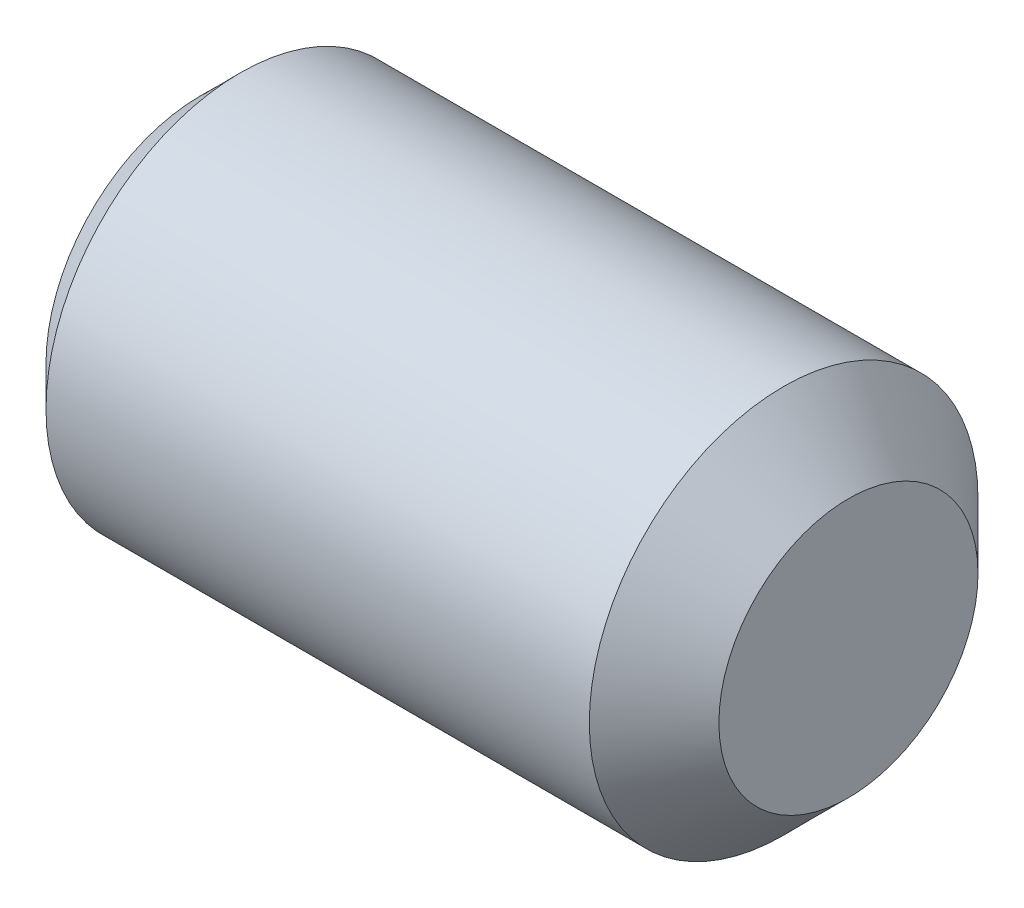
ISO-10303-21;
HEADER;
FILE_DESCRIPTION(('STEP AP214'),'2;1');
FILE_NAME('part.step','',(''),(''),'','','');
FILE_SCHEMA(('AUTOMOTIVE_DESIGN { 1 0 10303 214 1 1 1 1 }'));
ENDSEC;
DATA;
#1=APPLICATION_CONTEXT('core data for automotive mechanical design processes');
#2=APPLICATION_PROTOCOL_DEFINITION('international standard','automotive_design',2000,#1);
#3=PRODUCT_CONTEXT('',#1,'mechanical');
#4=PRODUCT('Part','Part','',(#3));
#5=PRODUCT_RELATED_PRODUCT_CATEGORY('part','',(#4));
#6=PRODUCT_DEFINITION_FORMATION('','',#4);
#7=PRODUCT_DEFINITION_CONTEXT('part definition',#1,'design');
#8=PRODUCT_DEFINITION('design','',#6,#7);
#9=PRODUCT_DEFINITION_SHAPE('','',#8);
#10=(LENGTH_UNIT() NAMED_UNIT(*) SI_UNIT(.MILLI.,.METRE.));
#11=(NAMED_UNIT(*) PLANE_ANGLE_UNIT() SI_UNIT($,.RADIAN.));
#12=(NAMED_UNIT(*) SI_UNIT($,.STERADIAN.) SOLID_ANGLE_UNIT());
#13=UNCERTAINTY_MEASURE_WITH_UNIT(LENGTH_MEASURE(1.E-05),#10,'distance_accuracy_value','');
#14=(GEOMETRIC_REPRESENTATION_CONTEXT(3) GLOBAL_UNCERTAINTY_ASSIGNED_CONTEXT((#13)) GLOBAL_UNIT_ASSIGNED_CONTEXT((#10,
#11,#12)) REPRESENTATION_CONTEXT('',''));
#15=CARTESIAN_POINT('',(0.,0.,0.));
#16=DIRECTION('',(0.,0.,1.));
#17=DIRECTION('',(1.,0.,0.));
#18=AXIS2_PLACEMENT_3D('',#15,#16,#17);
#19=CARTESIAN_POINT('',(-2.79999999992242,0.,0.));
#20=DIRECTION('',(-1.,0.,0.));
#21=DIRECTION('',(0.,0.,1.));
#22=AXIS2_PLACEMENT_3D('',#19,#20,#21);
#23=CONICAL_SURFACE('',#22,0.732679492102761,1.04719755050267);
#24=CARTESIAN_POINT('',(-2.37698729731051,0.,5.6843418860808E-11));
#25=VERTEX_POINT('',#24);
#26=VERTEX_LOOP('',#25);
#27=FACE_BOUND('',#26,.T.);
#28=CARTESIAN_POINT('',(-2.79999999992242,0.,0.));
#29=DIRECTION('',(-1.,0.,0.));
#30=DIRECTION('',(0.,0.,1.));
#31=AXIS2_PLACEMENT_3D('',#28,#29,#30);
#32=CIRCLE('',#31,0.732679492102761);
#33=CARTESIAN_POINT('',(-2.79999999992242,0.,0.732679492102761));
#34=VERTEX_POINT('',#33);
#35=EDGE_CURVE('E20',#34,#34,#32,.T.);
#36=ORIENTED_EDGE('',*,*,#35,.T.);
#37=EDGE_LOOP('',(#36));
#38=FACE_BOUND('',#37,.T.);
#39=ADVANCED_FACE('F17',(#27,#38),#23,.F.);
#40=CARTESIAN_POINT('',(-2.8,0.,0.));
#41=DIRECTION('',(1.,0.,0.));
#42=DIRECTION('',(0.,0.,-1.));
#43=AXIS2_PLACEMENT_3D('',#40,#41,#42);
#44=PLANE('',#43);
#45=DIRECTION('',(0.,-0.5,-0.866025403784439));
#46=VECTOR('',#45,1.);
#47=CARTESIAN_POINT('',(-2.79999999999921,-0.866025403784439,0.));
#48=LINE('',#47,#46);
#49=CARTESIAN_POINT('',(-2.79999999999967,-0.866025403784439,0.));
#50=VERTEX_POINT('',#49);
#51=CARTESIAN_POINT('',(-2.79999999999941,-0.433012701891514,0.750000000000408));
#52=VERTEX_POINT('',#51);
#53=EDGE_CURVE('E80',#50,#52,#48,.F.);
#54=ORIENTED_EDGE('',*,*,#53,.T.);
#55=DIRECTION('',(0.,1.,0.));
#56=VECTOR('',#55,1.);
#57=CARTESIAN_POINT('',(-2.79999999999921,-0.433012701892219,0.75));
#58=LINE('',#57,#56);
#59=CARTESIAN_POINT('',(-2.79999999999961,0.433012701892219,0.75));
#60=VERTEX_POINT('',#59);
#61=EDGE_CURVE('E115',#52,#60,#58,.T.);
#62=ORIENTED_EDGE('',*,*,#61,.T.);
#63=DIRECTION('',(0.,-0.5,0.866025403784439));
#64=VECTOR('',#63,1.);
#65=CARTESIAN_POINT('',(-2.79999999999921,0.433012701892219,0.75));
#66=LINE('',#65,#64);
#67=CARTESIAN_POINT('',(-2.79999999999961,0.866025403784439,0.));
#68=VERTEX_POINT('',#67);
#69=EDGE_CURVE('E121',#60,#68,#66,.F.);
#70=ORIENTED_EDGE('',*,*,#69,.T.);
#71=DIRECTION('',(0.,0.5,0.866025403784439));
#72=VECTOR('',#71,1.);
#73=CARTESIAN_POINT('',(-2.79999999999921,0.866025403784439,0.));
#74=LINE('',#73,#72);
#75=CARTESIAN_POINT('',(-2.79999999999961,0.433012701891161,-0.750000000000204));
#76=VERTEX_POINT('',#75);
#77=EDGE_CURVE('E125',#68,#76,#74,.F.);
#78=ORIENTED_EDGE('',*,*,#77,.T.);
#79=DIRECTION('',(0.,1.,0.));
#80=VECTOR('',#79,1.);
#81=CARTESIAN_POINT('',(-2.79999999999921,0.433012701892219,-0.75));
#82=LINE('',#81,#80);
#83=CARTESIAN_POINT('',(-2.79999999999967,-0.433012701892219,-0.75));
#84=VERTEX_POINT('',#83);
#85=EDGE_CURVE('E129',#76,#84,#82,.F.);
#86=ORIENTED_EDGE('',*,*,#85,.T.);
#87=DIRECTION('',(0.,0.5,-0.866025403784439));
#88=VECTOR('',#87,1.);
#89=CARTESIAN_POINT('',(-2.79999999999947,-0.433012701892219,-0.75));
#90=LINE('',#89,#88);
#91=EDGE_CURVE('E70',#84,#50,#90,.F.);
#92=ORIENTED_EDGE('',*,*,#91,.T.);
#93=EDGE_LOOP('',(#54,#62,#70,#78,#86,#92));
#94=FACE_BOUND('',#93,.T.);
#95=ORIENTED_EDGE('',*,*,#35,.F.);
#96=EDGE_LOOP('',(#95));
#97=FACE_BOUND('',#96,.T.);
#98=ADVANCED_FACE('F76',(#94,#97),#44,.F.);
#99=CARTESIAN_POINT('',(-4.,-0.866025403784439,0.));
#100=DIRECTION('',(0.,-0.866025403784439,0.5));
#101=DIRECTION('',(0.,-0.5,-0.866025403784439));
#102=AXIS2_PLACEMENT_3D('',#99,#100,#101);
#103=PLANE('',#102);
#104=DIRECTION('',(1.,0.,0.));
#105=VECTOR('',#104,1.);
#106=CARTESIAN_POINT('',(-4.,-0.433012701892219,0.75));
#107=LINE('',#106,#105);
#108=CARTESIAN_POINT('',(-4.,-0.433012701891984,0.750000000000408));
#109=VERTEX_POINT('',#108);
#110=EDGE_CURVE('E117',#109,#52,#107,.T.);
#111=ORIENTED_EDGE('',*,*,#110,.T.);
#112=ORIENTED_EDGE('',*,*,#53,.F.);
#113=DIRECTION('',(1.,0.,0.));
#114=VECTOR('',#113,1.);
#115=CARTESIAN_POINT('',(-4.,-0.866025403784438,0.));
#116=LINE('',#115,#114);
#117=CARTESIAN_POINT('',(-4.,-0.866025403784439,0.));
#118=VERTEX_POINT('',#117);
#119=EDGE_CURVE('E83',#50,#118,#116,.F.);
#120=ORIENTED_EDGE('',*,*,#119,.T.);
#121=DIRECTION('',(0.,-0.5,-0.866025403784439));
#122=VECTOR('',#121,1.);
#123=CARTESIAN_POINT('',(-4.,-0.433012701892219,0.75));
#124=LINE('',#123,#122);
#125=EDGE_CURVE('E112',#109,#118,#124,.T.);
#126=ORIENTED_EDGE('',*,*,#125,.F.);
#127=EDGE_LOOP('',(#111,#112,#120,#126));
#128=FACE_BOUND('',#127,.T.);
#129=ADVANCED_FACE('F133',(#128),#103,.F.);
#130=CARTESIAN_POINT('',(-4.,-0.433012701892219,-0.75));
#131=DIRECTION('',(0.,-0.866025403784439,-0.5));
#132=DIRECTION('',(0.,0.5,-0.866025403784439));
#133=AXIS2_PLACEMENT_3D('',#130,#131,#132);
#134=PLANE('',#133);
#135=ORIENTED_EDGE('',*,*,#119,.F.);
#136=ORIENTED_EDGE('',*,*,#91,.F.);
#137=DIRECTION('',(-1.,0.,0.));
#138=VECTOR('',#137,1.);
#139=CARTESIAN_POINT('',(-4.,-0.433012701892219,-0.75));
#140=LINE('',#139,#138);
#141=CARTESIAN_POINT('',(-4.,-0.433012701892219,-0.75));
#142=VERTEX_POINT('',#141);
#143=EDGE_CURVE('E127',#84,#142,#140,.T.);
#144=ORIENTED_EDGE('',*,*,#143,.T.);
#145=DIRECTION('',(0.,0.5,-0.866025403784438));
#146=VECTOR('',#145,1.);
#147=CARTESIAN_POINT('',(-4.,-0.866025403784439,0.));
#148=LINE('',#147,#146);
#149=EDGE_CURVE('E109',#118,#142,#148,.T.);
#150=ORIENTED_EDGE('',*,*,#149,.F.);
#151=EDGE_LOOP('',(#135,#136,#144,#150));
#152=FACE_BOUND('',#151,.T.);
#153=ADVANCED_FACE('F136',(#152),#134,.F.);
#154=CARTESIAN_POINT('',(-4.,0.433012701892219,-0.75));
#155=DIRECTION('',(0.,0.,-1.));
#156=DIRECTION('',(-1.,0.,0.));
#157=AXIS2_PLACEMENT_3D('',#154,#155,#156);
#158=PLANE('',#157);
#159=ORIENTED_EDGE('',*,*,#143,.F.);
#160=ORIENTED_EDGE('',*,*,#85,.F.);
#161=DIRECTION('',(1.,0.,0.));
#162=VECTOR('',#161,1.);
#163=CARTESIAN_POINT('',(-4.,0.433012701891749,-0.750000000000815));
#164=LINE('',#163,#162);
#165=CARTESIAN_POINT('',(-4.,0.433012701892102,-0.750000000000204));
#166=VERTEX_POINT('',#165);
#167=EDGE_CURVE('E123',#76,#166,#164,.F.);
#168=ORIENTED_EDGE('',*,*,#167,.T.);
#169=DIRECTION('',(0.,1.,0.));
#170=VECTOR('',#169,1.);
#171=CARTESIAN_POINT('',(-4.,0.59675,-0.75));
#172=LINE('',#171,#170);
#173=EDGE_CURVE('E106',#142,#166,#172,.T.);
#174=ORIENTED_EDGE('',*,*,#173,.F.);
#175=EDGE_LOOP('',(#159,#160,#168,#174));
#176=FACE_BOUND('',#175,.T.);
#177=ADVANCED_FACE('F209',(#176),#158,.F.);
#178=CARTESIAN_POINT('',(-4.,0.866025403784439,0.));
#179=DIRECTION('',(0.,0.866025403784439,-0.5));
#180=DIRECTION('',(0.,0.5,0.866025403784439));
#181=AXIS2_PLACEMENT_3D('',#178,#179,#180);
#182=PLANE('',#181);
#183=ORIENTED_EDGE('',*,*,#167,.F.);
#184=ORIENTED_EDGE('',*,*,#77,.F.);
#185=DIRECTION('',(1.,0.,0.));
#186=VECTOR('',#185,1.);
#187=CARTESIAN_POINT('',(-4.,0.866025403784438,0.));
#188=LINE('',#187,#186);
#189=CARTESIAN_POINT('',(-4.,0.866025403784439,0.));
#190=VERTEX_POINT('',#189);
#191=EDGE_CURVE('E119',#68,#190,#188,.F.);
#192=ORIENTED_EDGE('',*,*,#191,.T.);
#193=DIRECTION('',(0.,0.5,0.866025403784438));
#194=VECTOR('',#193,1.);
#195=CARTESIAN_POINT('',(-4.,0.433012701892219,-0.75));
#196=LINE('',#195,#194);
#197=EDGE_CURVE('E100',#166,#190,#196,.T.);
#198=ORIENTED_EDGE('',*,*,#197,.F.);
#199=EDGE_LOOP('',(#183,#184,#192,#198));
#200=FACE_BOUND('',#199,.T.);
#201=ADVANCED_FACE('F202',(#200),#182,.F.);
#202=CARTESIAN_POINT('',(-4.,0.433012701892219,0.75));
#203=DIRECTION('',(0.,0.866025403784439,0.5));
#204=DIRECTION('',(0.,-0.5,0.866025403784439));
#205=AXIS2_PLACEMENT_3D('',#202,#203,#204);
#206=PLANE('',#205);
#207=ORIENTED_EDGE('',*,*,#191,.F.);
#208=ORIENTED_EDGE('',*,*,#69,.F.);
#209=DIRECTION('',(1.,0.,0.));
#210=VECTOR('',#209,1.);
#211=CARTESIAN_POINT('',(-4.,0.433012701892219,0.75));
#212=LINE('',#211,#210);
#213=CARTESIAN_POINT('',(-4.,0.433012701892219,0.75));
#214=VERTEX_POINT('',#213);
#215=EDGE_CURVE('E35',#60,#214,#212,.F.);
#216=ORIENTED_EDGE('',*,*,#215,.T.);
#217=DIRECTION('',(0.,-0.5,0.866025403784438));
#218=VECTOR('',#217,1.);
#219=CARTESIAN_POINT('',(-4.,0.866025403784439,0.));
#220=LINE('',#219,#218);
#221=EDGE_CURVE('E95',#190,#214,#220,.T.);
#222=ORIENTED_EDGE('',*,*,#221,.F.);
#223=EDGE_LOOP('',(#207,#208,#216,#222));
#224=FACE_BOUND('',#223,.T.);
#225=ADVANCED_FACE('F153',(#224),#206,.F.);
#226=CARTESIAN_POINT('',(-4.,-0.433012701892219,0.75));
#227=DIRECTION('',(0.,0.,1.));
#228=DIRECTION('',(1.,0.,0.));
#229=AXIS2_PLACEMENT_3D('',#226,#227,#228);
#230=PLANE('',#229);
#231=ORIENTED_EDGE('',*,*,#215,.F.);
#232=ORIENTED_EDGE('',*,*,#61,.F.);
#233=ORIENTED_EDGE('',*,*,#110,.F.);
#234=DIRECTION('',(0.,1.,0.));
#235=VECTOR('',#234,1.);
#236=CARTESIAN_POINT('',(-4.,0.59675,0.75));
#237=LINE('',#236,#235);
#238=EDGE_CURVE('E91',#214,#109,#237,.F.);
#239=ORIENTED_EDGE('',*,*,#238,.F.);
#240=EDGE_LOOP('',(#231,#232,#233,#239));
#241=FACE_BOUND('',#240,.T.);
#242=ADVANCED_FACE('F142',(#241),#230,.F.);
#243=CARTESIAN_POINT('',(-4.,0.59675,0.));
#244=DIRECTION('',(-1.,0.,0.));
#245=DIRECTION('',(0.,0.,1.));
#246=AXIS2_PLACEMENT_3D('',#243,#244,#245);
#247=PLANE('',#246);
#248=CARTESIAN_POINT('',(-4.0000000000191,0.,0.));
#249=DIRECTION('',(1.,0.,0.));
#250=DIRECTION('',(0.,0.,-1.));
#251=AXIS2_PLACEMENT_3D('',#248,#249,#250);
#252=CIRCLE('',#251,1.1934999999994);
#253=CARTESIAN_POINT('',(-4.0000000000191,0.,-1.1934999999994));
#254=VERTEX_POINT('',#253);
#255=EDGE_CURVE('E89',#254,#254,#252,.T.);
#256=ORIENTED_EDGE('',*,*,#255,.F.);
#257=EDGE_LOOP('',(#256));
#258=FACE_BOUND('',#257,.T.);
#259=ORIENTED_EDGE('',*,*,#221,.T.);
#260=ORIENTED_EDGE('',*,*,#238,.T.);
#261=ORIENTED_EDGE('',*,*,#125,.T.);
#262=ORIENTED_EDGE('',*,*,#149,.T.);
#263=ORIENTED_EDGE('',*,*,#173,.T.);
#264=ORIENTED_EDGE('',*,*,#197,.T.);
#265=EDGE_LOOP('',(#259,#260,#261,#262,#263,#264));
#266=FACE_BOUND('',#265,.T.);
#267=ADVANCED_FACE('F139',(#258,#266),#247,.T.);
#268=CARTESIAN_POINT('',(1.,0.5,0.));
#269=DIRECTION('',(1.,0.,0.));
#270=DIRECTION('',(0.,0.,-1.));
#271=AXIS2_PLACEMENT_3D('',#268,#269,#270);
#272=PLANE('',#271);
#273=CARTESIAN_POINT('',(1.0000000000332,0.,0.));
#274=DIRECTION('',(-1.,0.,0.));
#275=DIRECTION('',(0.,0.,1.));
#276=AXIS2_PLACEMENT_3D('',#273,#274,#275);
#277=CIRCLE('',#276,0.99999999991951);
#278=CARTESIAN_POINT('',(1.0000000000332,0.,0.99999999991951));
#279=VERTEX_POINT('',#278);
#280=EDGE_CURVE('E87',#279,#279,#277,.T.);
#281=ORIENTED_EDGE('',*,*,#280,.F.);
#282=EDGE_LOOP('',(#281));
#283=FACE_BOUND('',#282,.T.);
#284=ADVANCED_FACE('F141',(#283),#272,.T.);
#285=CARTESIAN_POINT('',(-3.69350000005397,0.,0.));
#286=DIRECTION('',(1.,0.,0.));
#287=DIRECTION('',(0.,0.,-1.));
#288=AXIS2_PLACEMENT_3D('',#285,#286,#287);
#289=CONICAL_SURFACE('',#288,1.49999999996453,0.785398163397448);
#290=CARTESIAN_POINT('',(-3.6935,0.,0.));
#291=DIRECTION('',(1.,0.,0.));
#292=DIRECTION('',(0.,0.,-1.));
#293=AXIS2_PLACEMENT_3D('',#290,#291,#292);
#294=CIRCLE('',#293,1.5);
#295=CARTESIAN_POINT('',(-3.6935,0.,-1.5));
#296=VERTEX_POINT('',#295);
#297=EDGE_CURVE('E26',#296,#296,#294,.T.);
#298=ORIENTED_EDGE('',*,*,#297,.F.);
#299=EDGE_LOOP('',(#298));
#300=FACE_BOUND('',#299,.T.);
#301=ORIENTED_EDGE('',*,*,#255,.T.);
#302=EDGE_LOOP('',(#301));
#303=FACE_BOUND('',#302,.T.);
#304=ADVANCED_FACE('F150',(#300,#303),#289,.T.);
#305=CARTESIAN_POINT('',(0.499999999931333,0.,0.));
#306=DIRECTION('',(-1.,0.,0.));
#307=DIRECTION('',(0.,0.,1.));
#308=AXIS2_PLACEMENT_3D('',#305,#306,#307);
#309=CONICAL_SURFACE('',#308,1.50000000002137,0.785398163397448);
#310=CARTESIAN_POINT('',(0.5,0.,0.));
#311=DIRECTION('',(1.,0.,0.));
#312=DIRECTION('',(0.,0.,-1.));
#313=AXIS2_PLACEMENT_3D('',#310,#311,#312);
#314=CIRCLE('',#313,1.5);
#315=CARTESIAN_POINT('',(0.5,0.,-1.5));
#316=VERTEX_POINT('',#315);
#317=EDGE_CURVE('E11',#316,#316,#314,.F.);
#318=ORIENTED_EDGE('',*,*,#317,.F.);
#319=EDGE_LOOP('',(#318));
#320=FACE_BOUND('',#319,.T.);
#321=ORIENTED_EDGE('',*,*,#280,.T.);
#322=EDGE_LOOP('',(#321));
#323=FACE_BOUND('',#322,.T.);
#324=ADVANCED_FACE('F158',(#320,#323),#309,.T.);
#325=CARTESIAN_POINT('',(-0.0967500000000001,0.,0.));
#326=DIRECTION('',(1.,0.,0.));
#327=DIRECTION('',(0.,0.,-1.));
#328=AXIS2_PLACEMENT_3D('',#325,#326,#327);
#329=CYLINDRICAL_SURFACE('',#328,1.5);
#330=ORIENTED_EDGE('',*,*,#317,.T.);
#331=EDGE_LOOP('',(#330));
#332=FACE_BOUND('',#331,.T.);
#333=ORIENTED_EDGE('',*,*,#297,.T.);
#334=EDGE_LOOP('',(#333));
#335=FACE_BOUND('',#334,.T.);
#336=ADVANCED_FACE('F156',(#332,#335),#329,.T.);
#337=CLOSED_SHELL('',(#39,#98,#129,#153,#177,#201,#225,#242,#267,#284,#304,#324,#336));
#338=MANIFOLD_SOLID_BREP('B1',#337);
#339=ADVANCED_BREP_SHAPE_REPRESENTATION('',(#18,#338),#14);
#340=SHAPE_DEFINITION_REPRESENTATION(#9,#339);
ENDSEC;
END-ISO-10303-21;
